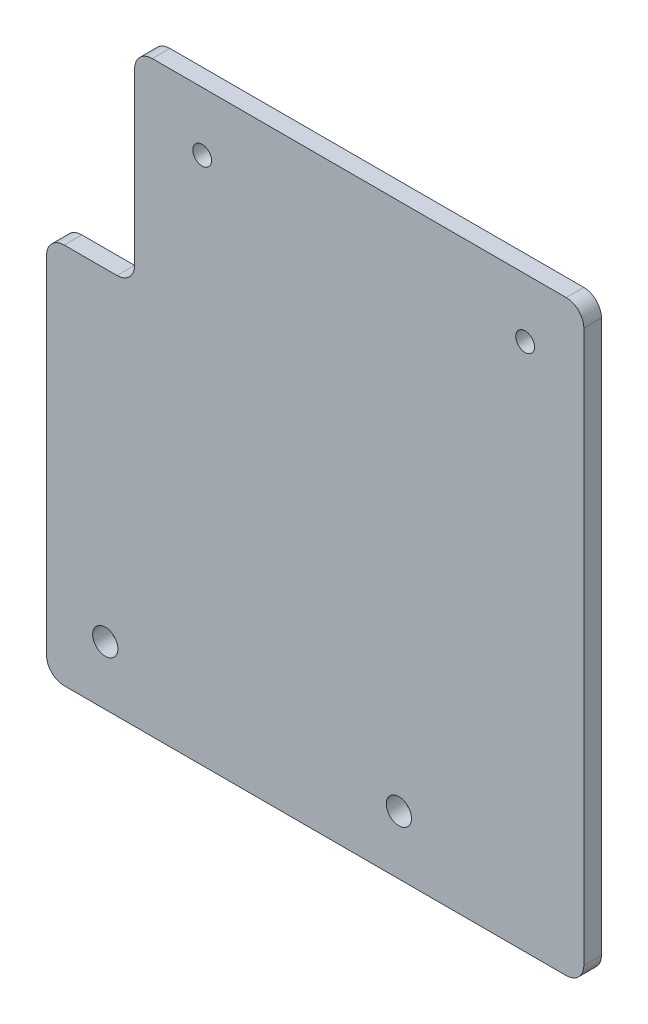
ISO-10303-21;
HEADER;
FILE_DESCRIPTION(('STEP AP214'),'2;1');
FILE_NAME('part.step','',(''),(''),'','','');
FILE_SCHEMA(('AUTOMOTIVE_DESIGN { 1 0 10303 214 1 1 1 1 }'));
ENDSEC;
DATA;
#1=APPLICATION_CONTEXT('core data for automotive mechanical design processes');
#2=APPLICATION_PROTOCOL_DEFINITION('international standard','automotive_design',2000,#1);
#3=PRODUCT_CONTEXT('',#1,'mechanical');
#4=PRODUCT('Part','Part','',(#3));
#5=PRODUCT_RELATED_PRODUCT_CATEGORY('part','',(#4));
#6=PRODUCT_DEFINITION_FORMATION('','',#4);
#7=PRODUCT_DEFINITION_CONTEXT('part definition',#1,'design');
#8=PRODUCT_DEFINITION('design','',#6,#7);
#9=PRODUCT_DEFINITION_SHAPE('','',#8);
#10=(LENGTH_UNIT() NAMED_UNIT(*) SI_UNIT(.MILLI.,.METRE.));
#11=(NAMED_UNIT(*) PLANE_ANGLE_UNIT() SI_UNIT($,.RADIAN.));
#12=(NAMED_UNIT(*) SI_UNIT($,.STERADIAN.) SOLID_ANGLE_UNIT());
#13=UNCERTAINTY_MEASURE_WITH_UNIT(LENGTH_MEASURE(1.E-05),#10,'distance_accuracy_value','');
#14=(GEOMETRIC_REPRESENTATION_CONTEXT(3) GLOBAL_UNCERTAINTY_ASSIGNED_CONTEXT((#13)) GLOBAL_UNIT_ASSIGNED_CONTEXT((#10,
#11,#12)) REPRESENTATION_CONTEXT('',''));
#15=CARTESIAN_POINT('',(0.,0.,0.));
#16=DIRECTION('',(0.,0.,1.));
#17=DIRECTION('',(1.,0.,0.));
#18=AXIS2_PLACEMENT_3D('',#15,#16,#17);
#19=CARTESIAN_POINT('',(-35.,-10.,3.));
#20=DIRECTION('',(1.,0.,0.));
#21=DIRECTION('',(0.,0.,-1.));
#22=AXIS2_PLACEMENT_3D('',#19,#20,#21);
#23=PLANE('',#22);
#24=DIRECTION('',(0.,-1.,0.));
#25=VECTOR('',#24,1.);
#26=CARTESIAN_POINT('',(-35.,-10.,3.));
#27=LINE('',#26,#25);
#28=CARTESIAN_POINT('',(-35.,52.,3.));
#29=VERTEX_POINT('',#28);
#30=CARTESIAN_POINT('',(-35.,-7.00000000000001,3.));
#31=VERTEX_POINT('',#30);
#32=EDGE_CURVE('E153',#29,#31,#27,.T.);
#33=ORIENTED_EDGE('',*,*,#32,.F.);
#34=DIRECTION('',(0.,0.,1.));
#35=VECTOR('',#34,1.);
#36=CARTESIAN_POINT('',(-35.,52.,3.));
#37=LINE('',#36,#35);
#38=CARTESIAN_POINT('',(-35.,52.,0.));
#39=VERTEX_POINT('',#38);
#40=EDGE_CURVE('E59',#29,#39,#37,.F.);
#41=ORIENTED_EDGE('',*,*,#40,.T.);
#42=DIRECTION('',(0.,-1.,0.));
#43=VECTOR('',#42,1.);
#44=CARTESIAN_POINT('',(-35.,-10.,0.));
#45=LINE('',#44,#43);
#46=CARTESIAN_POINT('',(-35.,-7.00000000000001,0.));
#47=VERTEX_POINT('',#46);
#48=EDGE_CURVE('E252',#39,#47,#45,.T.);
#49=ORIENTED_EDGE('',*,*,#48,.T.);
#50=DIRECTION('',(0.,0.,-1.));
#51=VECTOR('',#50,1.);
#52=CARTESIAN_POINT('',(-35.,-7.00000000000001,3.));
#53=LINE('',#52,#51);
#54=EDGE_CURVE('E188',#47,#31,#53,.F.);
#55=ORIENTED_EDGE('',*,*,#54,.T.);
#56=EDGE_LOOP('',(#33,#41,#49,#55));
#57=FACE_BOUND('',#56,.T.);
#58=ADVANCED_FACE('F37',(#57),#23,.F.);
#59=CARTESIAN_POINT('',(56.5,-10.,3.));
#60=DIRECTION('',(0.,1.,0.));
#61=DIRECTION('',(-1.,0.,0.));
#62=AXIS2_PLACEMENT_3D('',#59,#60,#61);
#63=PLANE('',#62);
#64=DIRECTION('',(1.,0.,0.));
#65=VECTOR('',#64,1.);
#66=CARTESIAN_POINT('',(56.5,-10.,0.));
#67=LINE('',#66,#65);
#68=CARTESIAN_POINT('',(-32.,-10.,0.));
#69=VERTEX_POINT('',#68);
#70=CARTESIAN_POINT('',(53.5,-10.,0.));
#71=VERTEX_POINT('',#70);
#72=EDGE_CURVE('E159',#69,#71,#67,.T.);
#73=ORIENTED_EDGE('',*,*,#72,.T.);
#74=DIRECTION('',(0.,0.,-1.));
#75=VECTOR('',#74,1.);
#76=CARTESIAN_POINT('',(53.5,-10.,3.));
#77=LINE('',#76,#75);
#78=CARTESIAN_POINT('',(53.5,-10.,3.));
#79=VERTEX_POINT('',#78);
#80=EDGE_CURVE('E198',#71,#79,#77,.F.);
#81=ORIENTED_EDGE('',*,*,#80,.T.);
#82=DIRECTION('',(1.,0.,0.));
#83=VECTOR('',#82,1.);
#84=CARTESIAN_POINT('',(56.5,-10.,3.));
#85=LINE('',#84,#83);
#86=CARTESIAN_POINT('',(-32.,-10.,3.));
#87=VERTEX_POINT('',#86);
#88=EDGE_CURVE('E157',#87,#79,#85,.T.);
#89=ORIENTED_EDGE('',*,*,#88,.F.);
#90=DIRECTION('',(0.,0.,-1.));
#91=VECTOR('',#90,1.);
#92=CARTESIAN_POINT('',(-32.,-10.,3.));
#93=LINE('',#92,#91);
#94=EDGE_CURVE('E195',#87,#69,#93,.T.);
#95=ORIENTED_EDGE('',*,*,#94,.T.);
#96=EDGE_LOOP('',(#73,#81,#89,#95));
#97=FACE_BOUND('',#96,.T.);
#98=ADVANCED_FACE('F263',(#97),#63,.F.);
#99=CARTESIAN_POINT('',(56.5,-10.,3.));
#100=DIRECTION('',(-1.,0.,0.));
#101=DIRECTION('',(0.,-1.,0.));
#102=AXIS2_PLACEMENT_3D('',#99,#100,#101);
#103=PLANE('',#102);
#104=DIRECTION('',(0.,1.,0.));
#105=VECTOR('',#104,1.);
#106=CARTESIAN_POINT('',(56.5,-10.,0.));
#107=LINE('',#106,#105);
#108=CARTESIAN_POINT('',(56.5,-7.,0.));
#109=VERTEX_POINT('',#108);
#110=CARTESIAN_POINT('',(56.5,87.,0.));
#111=VERTEX_POINT('',#110);
#112=EDGE_CURVE('E154',#109,#111,#107,.T.);
#113=ORIENTED_EDGE('',*,*,#112,.T.);
#114=DIRECTION('',(0.,0.,-1.));
#115=VECTOR('',#114,1.);
#116=CARTESIAN_POINT('',(56.5,87.,3.));
#117=LINE('',#116,#115);
#118=CARTESIAN_POINT('',(56.5,87.,3.));
#119=VERTEX_POINT('',#118);
#120=EDGE_CURVE('E131',#111,#119,#117,.F.);
#121=ORIENTED_EDGE('',*,*,#120,.T.);
#122=DIRECTION('',(0.,1.,0.));
#123=VECTOR('',#122,1.);
#124=CARTESIAN_POINT('',(56.5,-10.,3.));
#125=LINE('',#124,#123);
#126=CARTESIAN_POINT('',(56.5,-7.,3.));
#127=VERTEX_POINT('',#126);
#128=EDGE_CURVE('E256',#127,#119,#125,.T.);
#129=ORIENTED_EDGE('',*,*,#128,.F.);
#130=DIRECTION('',(0.,0.,-1.));
#131=VECTOR('',#130,1.);
#132=CARTESIAN_POINT('',(56.5,-7.,3.));
#133=LINE('',#132,#131);
#134=EDGE_CURVE('E191',#127,#109,#133,.T.);
#135=ORIENTED_EDGE('',*,*,#134,.T.);
#136=EDGE_LOOP('',(#113,#121,#129,#135));
#137=FACE_BOUND('',#136,.T.);
#138=ADVANCED_FACE('F272',(#137),#103,.F.);
#139=CARTESIAN_POINT('',(56.5,90.,3.));
#140=DIRECTION('',(0.,-1.,0.));
#141=DIRECTION('',(0.,0.,-1.));
#142=AXIS2_PLACEMENT_3D('',#139,#140,#141);
#143=PLANE('',#142);
#144=DIRECTION('',(-1.,0.,0.));
#145=VECTOR('',#144,1.);
#146=CARTESIAN_POINT('',(56.5,90.,0.));
#147=LINE('',#146,#145);
#148=CARTESIAN_POINT('',(53.5,90.,0.));
#149=VERTEX_POINT('',#148);
#150=CARTESIAN_POINT('',(-17.,90.,0.));
#151=VERTEX_POINT('',#150);
#152=EDGE_CURVE('E143',#149,#151,#147,.T.);
#153=ORIENTED_EDGE('',*,*,#152,.T.);
#154=DIRECTION('',(0.,0.,1.));
#155=VECTOR('',#154,1.);
#156=CARTESIAN_POINT('',(-17.,90.,3.));
#157=LINE('',#156,#155);
#158=CARTESIAN_POINT('',(-17.,90.,3.));
#159=VERTEX_POINT('',#158);
#160=EDGE_CURVE('E147',#151,#159,#157,.T.);
#161=ORIENTED_EDGE('',*,*,#160,.T.);
#162=DIRECTION('',(-1.,0.,0.));
#163=VECTOR('',#162,1.);
#164=CARTESIAN_POINT('',(56.5,90.,3.));
#165=LINE('',#164,#163);
#166=CARTESIAN_POINT('',(53.5,90.,3.));
#167=VERTEX_POINT('',#166);
#168=EDGE_CURVE('E146',#167,#159,#165,.T.);
#169=ORIENTED_EDGE('',*,*,#168,.F.);
#170=DIRECTION('',(0.,0.,-1.));
#171=VECTOR('',#170,1.);
#172=CARTESIAN_POINT('',(53.5,90.,3.));
#173=LINE('',#172,#171);
#174=EDGE_CURVE('E130',#167,#149,#173,.T.);
#175=ORIENTED_EDGE('',*,*,#174,.T.);
#176=EDGE_LOOP('',(#153,#161,#169,#175));
#177=FACE_BOUND('',#176,.T.);
#178=ADVANCED_FACE('F141',(#177),#143,.F.);
#179=CARTESIAN_POINT('',(0.,0.,3.));
#180=DIRECTION('',(0.,0.,1.));
#181=DIRECTION('',(1.,0.,0.));
#182=AXIS2_PLACEMENT_3D('',#179,#180,#181);
#183=PLANE('',#182);
#184=ORIENTED_EDGE('',*,*,#168,.T.);
#185=CARTESIAN_POINT('',(-17.,87.,3.));
#186=DIRECTION('',(0.,0.,1.));
#187=DIRECTION('',(1.,0.,0.));
#188=AXIS2_PLACEMENT_3D('',#185,#186,#187);
#189=CIRCLE('',#188,3.);
#190=CARTESIAN_POINT('',(-20.,87.,3.));
#191=VERTEX_POINT('',#190);
#192=EDGE_CURVE('E172',#159,#191,#189,.T.);
#193=ORIENTED_EDGE('',*,*,#192,.T.);
#194=DIRECTION('',(0.,1.,0.));
#195=VECTOR('',#194,1.);
#196=CARTESIAN_POINT('',(-20.,90.,3.));
#197=LINE('',#196,#195);
#198=CARTESIAN_POINT('',(-20.,58.,3.));
#199=VERTEX_POINT('',#198);
#200=EDGE_CURVE('E207',#199,#191,#197,.T.);
#201=ORIENTED_EDGE('',*,*,#200,.F.);
#202=CARTESIAN_POINT('',(-23.,58.,3.));
#203=DIRECTION('',(0.,0.,1.));
#204=DIRECTION('',(1.,0.,0.));
#205=AXIS2_PLACEMENT_3D('',#202,#203,#204);
#206=CIRCLE('',#205,3.);
#207=CARTESIAN_POINT('',(-23.,55.,3.));
#208=VERTEX_POINT('',#207);
#209=EDGE_CURVE('E45',#199,#208,#206,.F.);
#210=ORIENTED_EDGE('',*,*,#209,.T.);
#211=DIRECTION('',(1.,0.,0.));
#212=VECTOR('',#211,1.);
#213=CARTESIAN_POINT('',(-20.,55.,3.));
#214=LINE('',#213,#212);
#215=CARTESIAN_POINT('',(-32.,55.,3.));
#216=VERTEX_POINT('',#215);
#217=EDGE_CURVE('E205',#216,#208,#214,.T.);
#218=ORIENTED_EDGE('',*,*,#217,.F.);
#219=CARTESIAN_POINT('',(-32.,52.,3.));
#220=DIRECTION('',(0.,0.,1.));
#221=DIRECTION('',(1.,0.,0.));
#222=AXIS2_PLACEMENT_3D('',#219,#220,#221);
#223=CIRCLE('',#222,3.);
#224=EDGE_CURVE('E170',#216,#29,#223,.T.);
#225=ORIENTED_EDGE('',*,*,#224,.T.);
#226=ORIENTED_EDGE('',*,*,#32,.T.);
#227=CARTESIAN_POINT('',(-32.,-7.00000000000001,3.));
#228=DIRECTION('',(0.,0.,1.));
#229=DIRECTION('',(1.,0.,0.));
#230=AXIS2_PLACEMENT_3D('',#227,#228,#229);
#231=CIRCLE('',#230,3.);
#232=EDGE_CURVE('E164',#31,#87,#231,.T.);
#233=ORIENTED_EDGE('',*,*,#232,.T.);
#234=ORIENTED_EDGE('',*,*,#88,.T.);
#235=CARTESIAN_POINT('',(53.5,-7.,3.));
#236=DIRECTION('',(0.,0.,1.));
#237=DIRECTION('',(1.,0.,0.));
#238=AXIS2_PLACEMENT_3D('',#235,#236,#237);
#239=CIRCLE('',#238,3.);
#240=EDGE_CURVE('E166',#79,#127,#239,.T.);
#241=ORIENTED_EDGE('',*,*,#240,.T.);
#242=ORIENTED_EDGE('',*,*,#128,.T.);
#243=CARTESIAN_POINT('',(53.5,87.,3.));
#244=DIRECTION('',(0.,0.,1.));
#245=DIRECTION('',(1.,0.,0.));
#246=AXIS2_PLACEMENT_3D('',#243,#244,#245);
#247=CIRCLE('',#246,3.);
#248=EDGE_CURVE('E168',#119,#167,#247,.T.);
#249=ORIENTED_EDGE('',*,*,#248,.T.);
#250=EDGE_LOOP('',(#184,#193,#201,#210,#218,#225,#226,#233,#234,#241,#242,#249));
#251=FACE_BOUND('',#250,.T.);
#252=CARTESIAN_POINT('',(-8.5,80.,3.));
#253=DIRECTION('',(0.,0.,1.));
#254=DIRECTION('',(1.,0.,0.));
#255=AXIS2_PLACEMENT_3D('',#252,#253,#254);
#256=CIRCLE('',#255,1.6);
#257=CARTESIAN_POINT('',(-6.9,80.,3.));
#258=VERTEX_POINT('',#257);
#259=EDGE_CURVE('E226',#258,#258,#256,.T.);
#260=ORIENTED_EDGE('',*,*,#259,.F.);
#261=EDGE_LOOP('',(#260));
#262=FACE_BOUND('',#261,.T.);
#263=CARTESIAN_POINT('',(46.5,80.,3.));
#264=DIRECTION('',(0.,0.,1.));
#265=DIRECTION('',(1.,0.,0.));
#266=AXIS2_PLACEMENT_3D('',#263,#264,#265);
#267=CIRCLE('',#266,1.6);
#268=CARTESIAN_POINT('',(48.1,80.,3.));
#269=VERTEX_POINT('',#268);
#270=EDGE_CURVE('E235',#269,#269,#267,.T.);
#271=ORIENTED_EDGE('',*,*,#270,.F.);
#272=EDGE_LOOP('',(#271));
#273=FACE_BOUND('',#272,.T.);
#274=CARTESIAN_POINT('',(-25.,0.,3.));
#275=DIRECTION('',(0.,0.,1.));
#276=DIRECTION('',(1.,0.,0.));
#277=AXIS2_PLACEMENT_3D('',#274,#275,#276);
#278=CIRCLE('',#277,2.15);
#279=CARTESIAN_POINT('',(-22.85,0.,3.));
#280=VERTEX_POINT('',#279);
#281=EDGE_CURVE('E241',#280,#280,#278,.T.);
#282=ORIENTED_EDGE('',*,*,#281,.F.);
#283=EDGE_LOOP('',(#282));
#284=FACE_BOUND('',#283,.T.);
#285=CARTESIAN_POINT('',(25.,0.,3.));
#286=DIRECTION('',(0.,0.,1.));
#287=DIRECTION('',(1.,0.,0.));
#288=AXIS2_PLACEMENT_3D('',#285,#286,#287);
#289=CIRCLE('',#288,2.15);
#290=CARTESIAN_POINT('',(27.15,0.,3.));
#291=VERTEX_POINT('',#290);
#292=EDGE_CURVE('E247',#291,#291,#289,.T.);
#293=ORIENTED_EDGE('',*,*,#292,.F.);
#294=EDGE_LOOP('',(#293));
#295=FACE_BOUND('',#294,.T.);
#296=ADVANCED_FACE('F203',(#251,#262,#273,#284,#295),#183,.T.);
#297=CARTESIAN_POINT('',(0.,0.,0.));
#298=DIRECTION('',(0.,0.,1.));
#299=DIRECTION('',(1.,0.,0.));
#300=AXIS2_PLACEMENT_3D('',#297,#298,#299);
#301=PLANE('',#300);
#302=CARTESIAN_POINT('',(-8.5,80.,0.));
#303=DIRECTION('',(0.,0.,1.));
#304=DIRECTION('',(1.,0.,0.));
#305=AXIS2_PLACEMENT_3D('',#302,#303,#304);
#306=CIRCLE('',#305,1.6);
#307=CARTESIAN_POINT('',(-6.9,80.,0.));
#308=VERTEX_POINT('',#307);
#309=EDGE_CURVE('E232',#308,#308,#306,.T.);
#310=ORIENTED_EDGE('',*,*,#309,.T.);
#311=EDGE_LOOP('',(#310));
#312=FACE_BOUND('',#311,.T.);
#313=CARTESIAN_POINT('',(46.5,80.,0.));
#314=DIRECTION('',(0.,0.,1.));
#315=DIRECTION('',(1.,0.,0.));
#316=AXIS2_PLACEMENT_3D('',#313,#314,#315);
#317=CIRCLE('',#316,1.6);
#318=CARTESIAN_POINT('',(48.1,80.,0.));
#319=VERTEX_POINT('',#318);
#320=EDGE_CURVE('E238',#319,#319,#317,.T.);
#321=ORIENTED_EDGE('',*,*,#320,.T.);
#322=EDGE_LOOP('',(#321));
#323=FACE_BOUND('',#322,.T.);
#324=CARTESIAN_POINT('',(-25.,0.,0.));
#325=DIRECTION('',(0.,0.,1.));
#326=DIRECTION('',(1.,0.,0.));
#327=AXIS2_PLACEMENT_3D('',#324,#325,#326);
#328=CIRCLE('',#327,2.15);
#329=CARTESIAN_POINT('',(-22.85,0.,0.));
#330=VERTEX_POINT('',#329);
#331=EDGE_CURVE('E244',#330,#330,#328,.T.);
#332=ORIENTED_EDGE('',*,*,#331,.T.);
#333=EDGE_LOOP('',(#332));
#334=FACE_BOUND('',#333,.T.);
#335=CARTESIAN_POINT('',(25.,0.,0.));
#336=DIRECTION('',(0.,0.,1.));
#337=DIRECTION('',(1.,0.,0.));
#338=AXIS2_PLACEMENT_3D('',#335,#336,#337);
#339=CIRCLE('',#338,2.15);
#340=CARTESIAN_POINT('',(27.15,0.,0.));
#341=VERTEX_POINT('',#340);
#342=EDGE_CURVE('E250',#341,#341,#339,.T.);
#343=ORIENTED_EDGE('',*,*,#342,.T.);
#344=EDGE_LOOP('',(#343));
#345=FACE_BOUND('',#344,.T.);
#346=DIRECTION('',(0.,1.,0.));
#347=VECTOR('',#346,1.);
#348=CARTESIAN_POINT('',(-20.,90.,0.));
#349=LINE('',#348,#347);
#350=CARTESIAN_POINT('',(-20.,58.,0.));
#351=VERTEX_POINT('',#350);
#352=CARTESIAN_POINT('',(-20.,87.,0.));
#353=VERTEX_POINT('',#352);
#354=EDGE_CURVE('E216',#351,#353,#349,.T.);
#355=ORIENTED_EDGE('',*,*,#354,.T.);
#356=CARTESIAN_POINT('',(-17.,87.,0.));
#357=DIRECTION('',(0.,0.,1.));
#358=DIRECTION('',(1.,0.,0.));
#359=AXIS2_PLACEMENT_3D('',#356,#357,#358);
#360=CIRCLE('',#359,3.);
#361=EDGE_CURVE('E152',#353,#151,#360,.F.);
#362=ORIENTED_EDGE('',*,*,#361,.T.);
#363=ORIENTED_EDGE('',*,*,#152,.F.);
#364=CARTESIAN_POINT('',(53.5,87.,0.));
#365=DIRECTION('',(0.,0.,1.));
#366=DIRECTION('',(1.,0.,0.));
#367=AXIS2_PLACEMENT_3D('',#364,#365,#366);
#368=CIRCLE('',#367,3.);
#369=EDGE_CURVE('E126',#149,#111,#368,.F.);
#370=ORIENTED_EDGE('',*,*,#369,.T.);
#371=ORIENTED_EDGE('',*,*,#112,.F.);
#372=CARTESIAN_POINT('',(53.5,-7.,0.));
#373=DIRECTION('',(0.,0.,1.));
#374=DIRECTION('',(1.,0.,0.));
#375=AXIS2_PLACEMENT_3D('',#372,#373,#374);
#376=CIRCLE('',#375,3.);
#377=EDGE_CURVE('E136',#109,#71,#376,.F.);
#378=ORIENTED_EDGE('',*,*,#377,.T.);
#379=ORIENTED_EDGE('',*,*,#72,.F.);
#380=CARTESIAN_POINT('',(-32.,-7.00000000000001,0.));
#381=DIRECTION('',(0.,0.,1.));
#382=DIRECTION('',(1.,0.,0.));
#383=AXIS2_PLACEMENT_3D('',#380,#381,#382);
#384=CIRCLE('',#383,3.);
#385=EDGE_CURVE('E52',#69,#47,#384,.F.);
#386=ORIENTED_EDGE('',*,*,#385,.T.);
#387=ORIENTED_EDGE('',*,*,#48,.F.);
#388=CARTESIAN_POINT('',(-32.,52.,0.));
#389=DIRECTION('',(0.,0.,1.));
#390=DIRECTION('',(1.,0.,0.));
#391=AXIS2_PLACEMENT_3D('',#388,#389,#390);
#392=CIRCLE('',#391,3.);
#393=CARTESIAN_POINT('',(-32.,55.,0.));
#394=VERTEX_POINT('',#393);
#395=EDGE_CURVE('E135',#39,#394,#392,.F.);
#396=ORIENTED_EDGE('',*,*,#395,.T.);
#397=DIRECTION('',(1.,0.,0.));
#398=VECTOR('',#397,1.);
#399=CARTESIAN_POINT('',(-20.,55.,0.));
#400=LINE('',#399,#398);
#401=CARTESIAN_POINT('',(-23.,55.,0.));
#402=VERTEX_POINT('',#401);
#403=EDGE_CURVE('E221',#394,#402,#400,.T.);
#404=ORIENTED_EDGE('',*,*,#403,.T.);
#405=CARTESIAN_POINT('',(-23.,58.,0.));
#406=DIRECTION('',(0.,0.,1.));
#407=DIRECTION('',(1.,0.,0.));
#408=AXIS2_PLACEMENT_3D('',#405,#406,#407);
#409=CIRCLE('',#408,3.);
#410=EDGE_CURVE('E11',#402,#351,#409,.T.);
#411=ORIENTED_EDGE('',*,*,#410,.T.);
#412=EDGE_LOOP('',(#355,#362,#363,#370,#371,#378,#379,#386,#387,#396,#404,#411));
#413=FACE_BOUND('',#412,.T.);
#414=ADVANCED_FACE('F150',(#312,#323,#334,#345,#413),#301,.F.);
#415=CARTESIAN_POINT('',(25.,0.,3.));
#416=DIRECTION('',(0.,0.,1.));
#417=DIRECTION('',(1.,0.,0.));
#418=AXIS2_PLACEMENT_3D('',#415,#416,#417);
#419=CYLINDRICAL_SURFACE('',#418,2.15);
#420=ORIENTED_EDGE('',*,*,#342,.F.);
#421=EDGE_LOOP('',(#420));
#422=FACE_BOUND('',#421,.T.);
#423=ORIENTED_EDGE('',*,*,#292,.T.);
#424=EDGE_LOOP('',(#423));
#425=FACE_BOUND('',#424,.T.);
#426=ADVANCED_FACE('F371',(#422,#425),#419,.F.);
#427=CARTESIAN_POINT('',(-25.,0.,3.));
#428=DIRECTION('',(0.,0.,1.));
#429=DIRECTION('',(1.,0.,0.));
#430=AXIS2_PLACEMENT_3D('',#427,#428,#429);
#431=CYLINDRICAL_SURFACE('',#430,2.15);
#432=ORIENTED_EDGE('',*,*,#331,.F.);
#433=EDGE_LOOP('',(#432));
#434=FACE_BOUND('',#433,.T.);
#435=ORIENTED_EDGE('',*,*,#281,.T.);
#436=EDGE_LOOP('',(#435));
#437=FACE_BOUND('',#436,.T.);
#438=ADVANCED_FACE('F426',(#434,#437),#431,.F.);
#439=CARTESIAN_POINT('',(46.5,80.,3.));
#440=DIRECTION('',(0.,0.,1.));
#441=DIRECTION('',(1.,0.,0.));
#442=AXIS2_PLACEMENT_3D('',#439,#440,#441);
#443=CYLINDRICAL_SURFACE('',#442,1.6);
#444=ORIENTED_EDGE('',*,*,#320,.F.);
#445=EDGE_LOOP('',(#444));
#446=FACE_BOUND('',#445,.T.);
#447=ORIENTED_EDGE('',*,*,#270,.T.);
#448=EDGE_LOOP('',(#447));
#449=FACE_BOUND('',#448,.T.);
#450=ADVANCED_FACE('F415',(#446,#449),#443,.F.);
#451=CARTESIAN_POINT('',(-8.5,80.,3.));
#452=DIRECTION('',(0.,0.,1.));
#453=DIRECTION('',(1.,0.,0.));
#454=AXIS2_PLACEMENT_3D('',#451,#452,#453);
#455=CYLINDRICAL_SURFACE('',#454,1.6);
#456=ORIENTED_EDGE('',*,*,#309,.F.);
#457=EDGE_LOOP('',(#456));
#458=FACE_BOUND('',#457,.T.);
#459=ORIENTED_EDGE('',*,*,#259,.T.);
#460=EDGE_LOOP('',(#459));
#461=FACE_BOUND('',#460,.T.);
#462=ADVANCED_FACE('F359',(#458,#461),#455,.F.);
#463=CARTESIAN_POINT('',(-20.,90.,0.));
#464=DIRECTION('',(1.,0.,0.));
#465=DIRECTION('',(0.,1.,0.));
#466=AXIS2_PLACEMENT_3D('',#463,#464,#465);
#467=PLANE('',#466);
#468=ORIENTED_EDGE('',*,*,#200,.T.);
#469=DIRECTION('',(0.,0.,1.));
#470=VECTOR('',#469,1.);
#471=CARTESIAN_POINT('',(-20.,87.,0.));
#472=LINE('',#471,#470);
#473=EDGE_CURVE('E177',#191,#353,#472,.F.);
#474=ORIENTED_EDGE('',*,*,#473,.T.);
#475=ORIENTED_EDGE('',*,*,#354,.F.);
#476=DIRECTION('',(0.,0.,1.));
#477=VECTOR('',#476,1.);
#478=CARTESIAN_POINT('',(-20.,58.,3.));
#479=LINE('',#478,#477);
#480=EDGE_CURVE('E174',#351,#199,#479,.T.);
#481=ORIENTED_EDGE('',*,*,#480,.T.);
#482=EDGE_LOOP('',(#468,#474,#475,#481));
#483=FACE_BOUND('',#482,.T.);
#484=ADVANCED_FACE('F223',(#483),#467,.F.);
#485=CARTESIAN_POINT('',(-20.,55.,0.));
#486=DIRECTION('',(0.,-1.,0.));
#487=DIRECTION('',(1.,0.,0.));
#488=AXIS2_PLACEMENT_3D('',#485,#486,#487);
#489=PLANE('',#488);
#490=ORIENTED_EDGE('',*,*,#217,.T.);
#491=DIRECTION('',(0.,0.,1.));
#492=VECTOR('',#491,1.);
#493=CARTESIAN_POINT('',(-23.,55.,0.));
#494=LINE('',#493,#492);
#495=EDGE_CURVE('E186',#208,#402,#494,.F.);
#496=ORIENTED_EDGE('',*,*,#495,.T.);
#497=ORIENTED_EDGE('',*,*,#403,.F.);
#498=DIRECTION('',(0.,0.,1.));
#499=VECTOR('',#498,1.);
#500=CARTESIAN_POINT('',(-32.,55.,0.));
#501=LINE('',#500,#499);
#502=EDGE_CURVE('E183',#394,#216,#501,.T.);
#503=ORIENTED_EDGE('',*,*,#502,.T.);
#504=EDGE_LOOP('',(#490,#496,#497,#503));
#505=FACE_BOUND('',#504,.T.);
#506=ADVANCED_FACE('F212',(#505),#489,.F.);
#507=CARTESIAN_POINT('',(-17.,87.,3.));
#508=DIRECTION('',(0.,0.,1.));
#509=DIRECTION('',(1.,0.,0.));
#510=AXIS2_PLACEMENT_3D('',#507,#508,#509);
#511=CYLINDRICAL_SURFACE('',#510,3.);
#512=ORIENTED_EDGE('',*,*,#361,.F.);
#513=ORIENTED_EDGE('',*,*,#473,.F.);
#514=ORIENTED_EDGE('',*,*,#192,.F.);
#515=ORIENTED_EDGE('',*,*,#160,.F.);
#516=EDGE_LOOP('',(#512,#513,#514,#515));
#517=FACE_BOUND('',#516,.T.);
#518=ADVANCED_FACE('F286',(#517),#511,.T.);
#519=CARTESIAN_POINT('',(-23.,58.,0.));
#520=DIRECTION('',(0.,0.,-1.));
#521=DIRECTION('',(-1.,0.,0.));
#522=AXIS2_PLACEMENT_3D('',#519,#520,#521);
#523=CYLINDRICAL_SURFACE('',#522,3.);
#524=ORIENTED_EDGE('',*,*,#410,.F.);
#525=ORIENTED_EDGE('',*,*,#495,.F.);
#526=ORIENTED_EDGE('',*,*,#209,.F.);
#527=ORIENTED_EDGE('',*,*,#480,.F.);
#528=EDGE_LOOP('',(#524,#525,#526,#527));
#529=FACE_BOUND('',#528,.T.);
#530=ADVANCED_FACE('F219',(#529),#523,.F.);
#531=CARTESIAN_POINT('',(-32.,52.,0.));
#532=DIRECTION('',(0.,0.,1.));
#533=DIRECTION('',(1.,0.,0.));
#534=AXIS2_PLACEMENT_3D('',#531,#532,#533);
#535=CYLINDRICAL_SURFACE('',#534,3.);
#536=ORIENTED_EDGE('',*,*,#395,.F.);
#537=ORIENTED_EDGE('',*,*,#40,.F.);
#538=ORIENTED_EDGE('',*,*,#224,.F.);
#539=ORIENTED_EDGE('',*,*,#502,.F.);
#540=EDGE_LOOP('',(#536,#537,#538,#539));
#541=FACE_BOUND('',#540,.T.);
#542=ADVANCED_FACE('F292',(#541),#535,.T.);
#543=CARTESIAN_POINT('',(53.5,87.,3.));
#544=DIRECTION('',(0.,0.,-1.));
#545=DIRECTION('',(-1.,0.,0.));
#546=AXIS2_PLACEMENT_3D('',#543,#544,#545);
#547=CYLINDRICAL_SURFACE('',#546,3.);
#548=ORIENTED_EDGE('',*,*,#248,.F.);
#549=ORIENTED_EDGE('',*,*,#120,.F.);
#550=ORIENTED_EDGE('',*,*,#369,.F.);
#551=ORIENTED_EDGE('',*,*,#174,.F.);
#552=EDGE_LOOP('',(#548,#549,#550,#551));
#553=FACE_BOUND('',#552,.T.);
#554=ADVANCED_FACE('F129',(#553),#547,.T.);
#555=CARTESIAN_POINT('',(53.5,-7.,3.));
#556=DIRECTION('',(0.,0.,-1.));
#557=DIRECTION('',(-1.,0.,0.));
#558=AXIS2_PLACEMENT_3D('',#555,#556,#557);
#559=CYLINDRICAL_SURFACE('',#558,3.);
#560=ORIENTED_EDGE('',*,*,#240,.F.);
#561=ORIENTED_EDGE('',*,*,#80,.F.);
#562=ORIENTED_EDGE('',*,*,#377,.F.);
#563=ORIENTED_EDGE('',*,*,#134,.F.);
#564=EDGE_LOOP('',(#560,#561,#562,#563));
#565=FACE_BOUND('',#564,.T.);
#566=ADVANCED_FACE('F268',(#565),#559,.T.);
#567=CARTESIAN_POINT('',(-32.,-7.00000000000001,3.));
#568=DIRECTION('',(0.,0.,-1.));
#569=DIRECTION('',(-1.,0.,0.));
#570=AXIS2_PLACEMENT_3D('',#567,#568,#569);
#571=CYLINDRICAL_SURFACE('',#570,3.);
#572=ORIENTED_EDGE('',*,*,#232,.F.);
#573=ORIENTED_EDGE('',*,*,#54,.F.);
#574=ORIENTED_EDGE('',*,*,#385,.F.);
#575=ORIENTED_EDGE('',*,*,#94,.F.);
#576=EDGE_LOOP('',(#572,#573,#574,#575));
#577=FACE_BOUND('',#576,.T.);
#578=ADVANCED_FACE('F39',(#577),#571,.T.);
#579=CLOSED_SHELL('',(#58,#98,#138,#178,#296,#414,#426,#438,#450,#462,#484,#506,#518,#530,#542,
#554,#566,#578));
#580=MANIFOLD_SOLID_BREP('B2',#579);
#581=ADVANCED_BREP_SHAPE_REPRESENTATION('',(#18,#580),#14);
#582=SHAPE_DEFINITION_REPRESENTATION(#9,#581);
ENDSEC;
END-ISO-10303-21;
